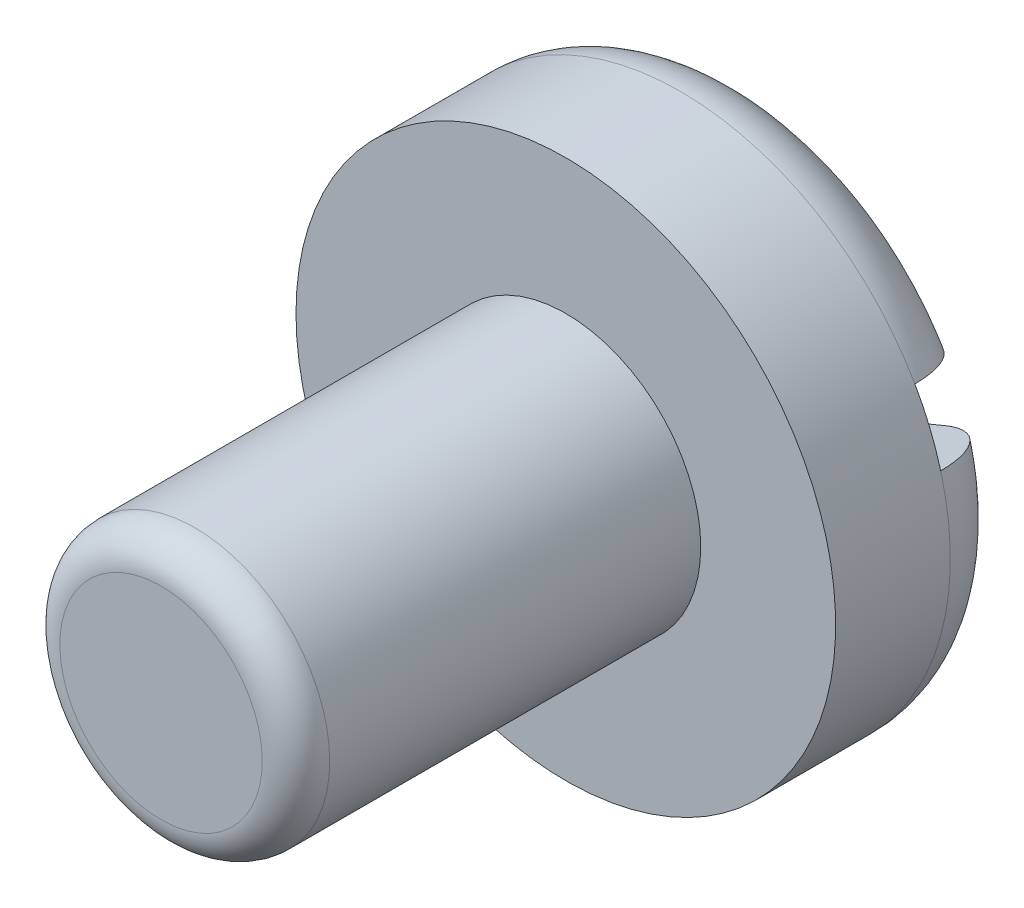
ISO-10303-21;
HEADER;
FILE_DESCRIPTION(('STEP AP214'),'2;1');
FILE_NAME('part.step','',(''),(''),'','','');
FILE_SCHEMA(('AUTOMOTIVE_DESIGN { 1 0 10303 214 1 1 1 1 }'));
ENDSEC;
DATA;
#1=APPLICATION_CONTEXT('core data for automotive mechanical design processes');
#2=APPLICATION_PROTOCOL_DEFINITION('international standard','automotive_design',2000,#1);
#3=PRODUCT_CONTEXT('',#1,'mechanical');
#4=PRODUCT('Part','Part','',(#3));
#5=PRODUCT_RELATED_PRODUCT_CATEGORY('part','',(#4));
#6=PRODUCT_DEFINITION_FORMATION('','',#4);
#7=PRODUCT_DEFINITION_CONTEXT('part definition',#1,'design');
#8=PRODUCT_DEFINITION('design','',#6,#7);
#9=PRODUCT_DEFINITION_SHAPE('','',#8);
#10=(LENGTH_UNIT() NAMED_UNIT(*) SI_UNIT(.MILLI.,.METRE.));
#11=(NAMED_UNIT(*) PLANE_ANGLE_UNIT() SI_UNIT($,.RADIAN.));
#12=(NAMED_UNIT(*) SI_UNIT($,.STERADIAN.) SOLID_ANGLE_UNIT());
#13=UNCERTAINTY_MEASURE_WITH_UNIT(LENGTH_MEASURE(1.E-05),#10,'distance_accuracy_value','');
#14=(GEOMETRIC_REPRESENTATION_CONTEXT(3) GLOBAL_UNCERTAINTY_ASSIGNED_CONTEXT((#13)) GLOBAL_UNIT_ASSIGNED_CONTEXT((#10,
#11,#12)) REPRESENTATION_CONTEXT('',''));
#15=CARTESIAN_POINT('',(0.,0.,0.));
#16=DIRECTION('',(0.,0.,1.));
#17=DIRECTION('',(1.,0.,0.));
#18=AXIS2_PLACEMENT_3D('',#15,#16,#17);
#19=CARTESIAN_POINT('',(-114.698131955546,-30.2113668745844,-143.199999999999));
#20=DIRECTION('',(0.,0.,1.));
#21=DIRECTION('',(1.,0.,0.));
#22=AXIS2_PLACEMENT_3D('',#19,#20,#21);
#23=PLANE('',#22);
#24=DIRECTION('',(-0.923728021347068,-0.383049008063238,0.));
#25=VECTOR('',#24,1.);
#26=CARTESIAN_POINT('',(-114.698131955546,-30.2113668745844,-143.199999999999));
#27=LINE('',#26,#25);
#28=CARTESIAN_POINT('',(-122.058975976254,-33.2637415297654,-143.199999999999));
#29=VERTEX_POINT('',#28);
#30=CARTESIAN_POINT('',(-114.727112105616,-30.2233842839093,-143.199999999999));
#31=VERTEX_POINT('',#30);
#32=EDGE_CURVE('E98',#29,#31,#27,.F.);
#33=ORIENTED_EDGE('',*,*,#32,.T.);
#34=CARTESIAN_POINT('',(-118.201519536903,-32.2054269175109,-143.199999999999));
#35=DIRECTION('',(0.,0.,-1.));
#36=DIRECTION('',(-1.,0.,0.));
#37=AXIS2_PLACEMENT_3D('',#34,#35,#36);
#38=CIRCLE('',#37,4.);
#39=CARTESIAN_POINT('',(-114.344063097552,-31.1471123052565,-143.199999999999));
#40=VERTEX_POINT('',#39);
#41=EDGE_CURVE('E63',#40,#31,#38,.F.);
#42=ORIENTED_EDGE('',*,*,#41,.F.);
#43=DIRECTION('',(0.923728021347068,0.383049008063238,0.));
#44=VECTOR('',#43,1.);
#45=CARTESIAN_POINT('',(-114.315082947483,-31.1350948959315,-143.199999999999));
#46=LINE('',#45,#44);
#47=CARTESIAN_POINT('',(-121.675926968191,-34.1874695511123,-143.199999999999));
#48=VERTEX_POINT('',#47);
#49=EDGE_CURVE('E85',#40,#48,#46,.F.);
#50=ORIENTED_EDGE('',*,*,#49,.T.);
#51=CARTESIAN_POINT('',(-118.201519536903,-32.2054269175109,-143.199999999999));
#52=DIRECTION('',(0.,0.,-1.));
#53=DIRECTION('',(-1.,0.,0.));
#54=AXIS2_PLACEMENT_3D('',#51,#52,#53);
#55=CIRCLE('',#54,4.);
#56=EDGE_CURVE('E69',#29,#48,#55,.F.);
#57=ORIENTED_EDGE('',*,*,#56,.F.);
#58=EDGE_LOOP('',(#33,#42,#50,#57));
#59=FACE_BOUND('',#58,.T.);
#60=ADVANCED_FACE('F17',(#59),#23,.F.);
#61=CARTESIAN_POINT('',(-114.698131955546,-30.2113668745844,-144.199999999999));
#62=DIRECTION('',(-0.383049008063238,0.923728021347068,0.));
#63=DIRECTION('',(-0.923728021347068,-0.383049008063238,0.));
#64=AXIS2_PLACEMENT_3D('',#61,#62,#63);
#65=PLANE('',#64);
#66=ORIENTED_EDGE('',*,*,#32,.F.);
#67=CARTESIAN_POINT('',(-121.125468377022,-32.8766371531072,-144.199999999999));
#68=CARTESIAN_POINT('',(-121.178461283274,-32.898612106454,-144.200042646425));
#69=CARTESIAN_POINT('',(-121.231439447351,-32.9205809465562,-144.195201543032));
#70=CARTESIAN_POINT('',(-121.33589363335,-32.9638957225621,-144.176032715164));
#71=CARTESIAN_POINT('',(-121.387370122207,-32.985241852093,-144.161707973106));
#72=CARTESIAN_POINT('',(-121.487421411564,-33.0267308469683,-144.123838052496));
#73=CARTESIAN_POINT('',(-121.53599397934,-33.0468727864524,-144.100285881759));
#74=CARTESIAN_POINT('',(-121.605501455679,-33.0756959565299,-144.058582449706));
#75=CARTESIAN_POINT('',(-121.628112836652,-33.0850723821143,-144.043618095936));
#76=CARTESIAN_POINT('',(-121.672100144509,-33.1033129185629,-144.011645047463));
#77=CARTESIAN_POINT('',(-121.693474825017,-33.1121765125832,-143.994634341773));
#78=CARTESIAN_POINT('',(-121.755088154336,-33.1377261593772,-143.941046440457));
#79=CARTESIAN_POINT('',(-121.793272156847,-33.1535601970458,-143.901638998176));
#80=CARTESIAN_POINT('',(-121.862900101569,-33.182433322623,-143.816376418218));
#81=CARTESIAN_POINT('',(-121.89434469714,-33.1954726814643,-143.770521906272));
#82=CARTESIAN_POINT('',(-121.935617730862,-33.2125876701424,-143.698165673121));
#83=CARTESIAN_POINT('',(-121.948352165085,-33.2178683504778,-143.6735609017));
#84=CARTESIAN_POINT('',(-121.971840406419,-33.2276083901172,-143.623297301745));
#85=CARTESIAN_POINT('',(-121.982595952564,-33.2320684705595,-143.597639423165));
#86=CARTESIAN_POINT('',(-122.011773324153,-33.2441676631646,-143.519329890651));
#87=CARTESIAN_POINT('',(-122.027138255246,-33.2505391507434,-143.465285506424));
#88=CARTESIAN_POINT('',(-122.045080423841,-33.2579793601169,-143.375729114559));
#89=CARTESIAN_POINT('',(-122.05028817785,-33.260138897298,-143.340798036497));
#90=CARTESIAN_POINT('',(-122.057234163745,-33.263019239721,-143.270585305094));
#91=CARTESIAN_POINT('',(-122.058977427703,-33.2637421316483,-143.235304235128));
#92=CARTESIAN_POINT('',(-122.058975976254,-33.2637415297655,-143.199999999999));
#93=B_SPLINE_CURVE_WITH_KNOTS('',3,(#67,#68,#69,#70,#71,#72,#73,#74,#75,#76,#77,#78,#79,#80,#81,
#82,#83,#84,#85,#86,#87,#88,#89,#90,#91,#92),.UNSPECIFIED.,.F.,.F.,(4,2,2,2,2,2,2,2,2,2,2,2,4),
(0.,0.171872419022453,0.343690813245548,0.515639657347851,0.601620525476747,0.687686589563902,
0.858146296579028,1.02858947074934,1.11311040629361,1.19755670683666,1.36625149222031,
1.4722222164145,1.57803890839399),.UNSPECIFIED.);
#94=CARTESIAN_POINT('',(-121.125468377022,-32.876637153107,-144.199999999999));
#95=VERTEX_POINT('',#94);
#96=EDGE_CURVE('E79',#95,#29,#93,.T.);
#97=ORIENTED_EDGE('',*,*,#96,.F.);
#98=DIRECTION('',(-0.923728021347073,-0.383049008063225,0.));
#99=VECTOR('',#98,1.);
#100=CARTESIAN_POINT('',(-115.660619704848,-30.6104886605678,-144.199999999999));
#101=LINE('',#100,#99);
#102=CARTESIAN_POINT('',(-115.660619704848,-30.6104886605678,-144.199999999999));
#103=VERTEX_POINT('',#102);
#104=EDGE_CURVE('E110',#103,#95,#101,.T.);
#105=ORIENTED_EDGE('',*,*,#104,.F.);
#106=CARTESIAN_POINT('',(-114.727112105615,-30.2233842839095,-143.199999999999));
#107=CARTESIAN_POINT('',(-114.727112209585,-30.2233843270233,-143.227961880797));
#108=CARTESIAN_POINT('',(-114.72820471632,-30.2238373647265,-143.255910312542));
#109=CARTESIAN_POINT('',(-114.732562632482,-30.225644493475,-143.311606244364));
#110=CARTESIAN_POINT('',(-114.735827914014,-30.2269985314848,-143.33935375617));
#111=CARTESIAN_POINT('',(-114.748849309514,-30.232398208137,-143.421937664908));
#112=CARTESIAN_POINT('',(-114.761831076235,-30.2377814516356,-143.476219338172));
#113=CARTESIAN_POINT('',(-114.79602291974,-30.2519600317329,-143.581648442153));
#114=CARTESIAN_POINT('',(-114.817236457162,-30.260756803379,-143.63279454419));
#115=CARTESIAN_POINT('',(-114.867272542123,-30.2815056301643,-143.730521336922));
#116=CARTESIAN_POINT('',(-114.896094144736,-30.2934572934639,-143.777102593589));
#117=CARTESIAN_POINT('',(-114.960598321075,-30.3202057087895,-143.864528526371));
#118=CARTESIAN_POINT('',(-114.996300700844,-30.3350106739307,-143.905356038563));
#119=CARTESIAN_POINT('',(-115.073512952559,-30.3670288391764,-143.980014616325));
#120=CARTESIAN_POINT('',(-115.115023152447,-30.3842421752711,-144.013845286546));
#121=CARTESIAN_POINT('',(-115.180875117601,-30.4115494879742,-144.058754059065));
#122=CARTESIAN_POINT('',(-115.203533194804,-30.4209452774238,-144.072800369914));
#123=CARTESIAN_POINT('',(-115.249831195341,-30.4401440055896,-144.098784085131));
#124=CARTESIAN_POINT('',(-115.27347021735,-30.4499465705467,-144.110723374733));
#125=CARTESIAN_POINT('',(-115.345648646063,-30.4798773238455,-144.143271250693));
#126=CARTESIAN_POINT('',(-115.395485393537,-30.5005434899073,-144.160634307904));
#127=CARTESIAN_POINT('',(-115.481401159921,-30.5361708047983,-144.182261856178));
#128=CARTESIAN_POINT('',(-115.516992590323,-30.5509297617599,-144.188913186675));
#129=CARTESIAN_POINT('',(-115.588589702589,-30.5806194563452,-144.197780726864));
#130=CARTESIAN_POINT('',(-115.624594679549,-30.5955499016613,-144.200003603459));
#131=CARTESIAN_POINT('',(-115.660619704848,-30.610488660568,-144.199999999999));
#132=B_SPLINE_CURVE_WITH_KNOTS('',3,(#106,#107,#108,#109,#110,#111,#112,#113,#114,#115,#116,
#117,#118,#119,#120,#121,#122,#123,#124,#125,#126,#127,#128,#129,#130,#131),.UNSPECIFIED.,.F.,
.F.,(4,2,2,2,2,2,2,2,2,2,2,2,4),(0.,0.0838339468248424,0.167662959367298,0.335013254061391,
0.502433979184718,0.669833920326452,0.837723113295849,1.00562179006333,1.09033330839502,
1.1749686434408,1.34410300766478,1.46117139805609,1.57806341197275),.UNSPECIFIED.);
#133=EDGE_CURVE('E96',#31,#103,#132,.T.);
#134=ORIENTED_EDGE('',*,*,#133,.F.);
#135=EDGE_LOOP('',(#66,#97,#105,#134));
#136=FACE_BOUND('',#135,.T.);
#137=ADVANCED_FACE('F219',(#136),#65,.F.);
#138=CARTESIAN_POINT('',(-114.315082947483,-31.1350948959315,-144.199999999999));
#139=DIRECTION('',(0.383049008063238,-0.923728021347068,0.));
#140=DIRECTION('',(0.923728021347068,0.383049008063238,0.));
#141=AXIS2_PLACEMENT_3D('',#138,#139,#140);
#142=PLANE('',#141);
#143=DIRECTION('',(0.923728021347054,0.383049008063273,0.));
#144=VECTOR('',#143,1.);
#145=CARTESIAN_POINT('',(-120.742419368958,-33.8003651744541,-144.199999999999));
#146=LINE('',#145,#144);
#147=CARTESIAN_POINT('',(-120.742419368958,-33.8003651744541,-144.199999999999));
#148=VERTEX_POINT('',#147);
#149=CARTESIAN_POINT('',(-115.277570696785,-31.534216681915,-144.199999999999));
#150=VERTEX_POINT('',#149);
#151=EDGE_CURVE('E87',#148,#150,#146,.T.);
#152=ORIENTED_EDGE('',*,*,#151,.F.);
#153=CARTESIAN_POINT('',(-121.675926968191,-34.1874695511124,-143.199999999999));
#154=CARTESIAN_POINT('',(-121.675926864221,-34.1874695079987,-143.227961880797));
#155=CARTESIAN_POINT('',(-121.674834357486,-34.1870164702955,-143.255910312542));
#156=CARTESIAN_POINT('',(-121.670476441324,-34.1852093415469,-143.311606244364));
#157=CARTESIAN_POINT('',(-121.667211159792,-34.1838553035371,-143.33935375617));
#158=CARTESIAN_POINT('',(-121.654189764292,-34.1784556268849,-143.421937664908));
#159=CARTESIAN_POINT('',(-121.641207997571,-34.1730723833863,-143.476219338172));
#160=CARTESIAN_POINT('',(-121.607016154066,-34.1588938032891,-143.581648442153));
#161=CARTESIAN_POINT('',(-121.585802616644,-34.1500970316429,-143.63279454419));
#162=CARTESIAN_POINT('',(-121.535766531683,-34.1293482048576,-143.730521336922));
#163=CARTESIAN_POINT('',(-121.50694492907,-34.117396541558,-143.777102593589));
#164=CARTESIAN_POINT('',(-121.442440752731,-34.0906481262325,-143.864528526371));
#165=CARTESIAN_POINT('',(-121.406738372962,-34.0758431610912,-143.905356038563));
#166=CARTESIAN_POINT('',(-121.329526121247,-34.0438249958455,-143.980014616325));
#167=CARTESIAN_POINT('',(-121.288015921359,-34.0266116597509,-144.013845286546));
#168=CARTESIAN_POINT('',(-121.222163956204,-33.9993043470477,-144.058754059065));
#169=CARTESIAN_POINT('',(-121.199505879001,-33.9899085575982,-144.072800369914));
#170=CARTESIAN_POINT('',(-121.153207878464,-33.9707098294323,-144.098784085131));
#171=CARTESIAN_POINT('',(-121.129568856456,-33.9609072644753,-144.110723374733));
#172=CARTESIAN_POINT('',(-121.057390427743,-33.9309765111764,-144.143271250693));
#173=CARTESIAN_POINT('',(-121.007553680269,-33.9103103451146,-144.160634307904));
#174=CARTESIAN_POINT('',(-120.921637913885,-33.8746830302236,-144.182261856178));
#175=CARTESIAN_POINT('',(-120.886046483482,-33.859924073262,-144.188913186675));
#176=CARTESIAN_POINT('',(-120.814449371217,-33.8302343786768,-144.197780726864));
#177=CARTESIAN_POINT('',(-120.778444394257,-33.8153039333607,-144.200003603459));
#178=CARTESIAN_POINT('',(-120.742419368958,-33.800365174454,-144.199999999999));
#179=B_SPLINE_CURVE_WITH_KNOTS('',3,(#153,#154,#155,#156,#157,#158,#159,#160,#161,#162,#163,
#164,#165,#166,#167,#168,#169,#170,#171,#172,#173,#174,#175,#176,#177,#178),.UNSPECIFIED.,.F.,
.F.,(4,2,2,2,2,2,2,2,2,2,2,2,4),(0.,0.0838339468248414,0.167662959367298,0.335013254061395,
0.50243397918474,0.669833920326474,0.837723113295902,1.00562179006339,1.09033330839508,
1.17496864344082,1.3441030076648,1.46117139805609,1.57806341197271),.UNSPECIFIED.);
#180=EDGE_CURVE('E83',#48,#148,#179,.T.);
#181=ORIENTED_EDGE('',*,*,#180,.F.);
#182=ORIENTED_EDGE('',*,*,#49,.F.);
#183=CARTESIAN_POINT('',(-115.277570696785,-31.5342166819151,-144.199999999999));
#184=CARTESIAN_POINT('',(-115.224577790533,-31.5122417285682,-144.200042646425));
#185=CARTESIAN_POINT('',(-115.171599626455,-31.490272888466,-144.195201543032));
#186=CARTESIAN_POINT('',(-115.067145440456,-31.4469581124602,-144.176032715164));
#187=CARTESIAN_POINT('',(-115.0156689516,-31.4256119829292,-144.161707973106));
#188=CARTESIAN_POINT('',(-114.915617662242,-31.3841229880539,-144.123838052496));
#189=CARTESIAN_POINT('',(-114.867045094466,-31.3639810485699,-144.10028588176));
#190=CARTESIAN_POINT('',(-114.797537618127,-31.3351578784923,-144.058582449707));
#191=CARTESIAN_POINT('',(-114.774926237155,-31.3257814529079,-144.043618095937));
#192=CARTESIAN_POINT('',(-114.730938929298,-31.3075409164593,-144.011645047463));
#193=CARTESIAN_POINT('',(-114.70956424879,-31.298677322439,-143.994634341774));
#194=CARTESIAN_POINT('',(-114.64795091947,-31.273127675645,-143.941046440458));
#195=CARTESIAN_POINT('',(-114.60976691696,-31.2572936379764,-143.901638998177));
#196=CARTESIAN_POINT('',(-114.540138972237,-31.2284205123991,-143.816376418219));
#197=CARTESIAN_POINT('',(-114.508694376667,-31.2153811535579,-143.770521906273));
#198=CARTESIAN_POINT('',(-114.467421342945,-31.1982661648797,-143.698165673121));
#199=CARTESIAN_POINT('',(-114.454686908721,-31.1929854845444,-143.673560901701));
#200=CARTESIAN_POINT('',(-114.431198667387,-31.1832454449049,-143.623297301745));
#201=CARTESIAN_POINT('',(-114.420443121243,-31.1787853644626,-143.597639423165));
#202=CARTESIAN_POINT('',(-114.391265749654,-31.1666861718575,-143.519329890652));
#203=CARTESIAN_POINT('',(-114.37590081856,-31.1603146842786,-143.465285506425));
#204=CARTESIAN_POINT('',(-114.357958649965,-31.1528744749051,-143.375729114559));
#205=CARTESIAN_POINT('',(-114.352750895956,-31.150714937724,-143.340798036497));
#206=CARTESIAN_POINT('',(-114.345804910061,-31.147834595301,-143.270585305094));
#207=CARTESIAN_POINT('',(-114.344061646103,-31.1471117033737,-143.235304235128));
#208=CARTESIAN_POINT('',(-114.344063097552,-31.1471123052565,-143.199999999999));
#209=B_SPLINE_CURVE_WITH_KNOTS('',3,(#183,#184,#185,#186,#187,#188,#189,#190,#191,#192,#193,
#194,#195,#196,#197,#198,#199,#200,#201,#202,#203,#204,#205,#206,#207,#208),.UNSPECIFIED.,.F.,
.F.,(4,2,2,2,2,2,2,2,2,2,2,2,4),(0.,0.171872419022462,0.343690813245583,0.515639657347896,
0.601620525476801,0.687686589563978,0.858146296579105,1.02858947074941,1.11311040629369,
1.19755670683674,1.36625149222042,1.47222221641493,1.57803890839475),.UNSPECIFIED.);
#210=EDGE_CURVE('E91',#150,#40,#209,.T.);
#211=ORIENTED_EDGE('',*,*,#210,.F.);
#212=EDGE_LOOP('',(#152,#181,#182,#211));
#213=FACE_BOUND('',#212,.T.);
#214=ADVANCED_FACE('F84',(#213),#142,.F.);
#215=CARTESIAN_POINT('',(-118.201519536903,-32.2054269175109,-144.199999999999));
#216=DIRECTION('',(0.,0.,-1.));
#217=DIRECTION('',(-1.,0.,0.));
#218=AXIS2_PLACEMENT_3D('',#215,#216,#217);
#219=PLANE('',#218);
#220=ORIENTED_EDGE('',*,*,#104,.T.);
#221=CARTESIAN_POINT('',(-118.201519536903,-32.2054269175109,-144.199999999999));
#222=DIRECTION('',(0.,0.,1.));
#223=DIRECTION('',(0.846966610685103,0.531646085647764,0.));
#224=AXIS2_PLACEMENT_3D('',#221,#222,#223);
#225=CIRCLE('',#224,2.99999999999964);
#226=EDGE_CURVE('E186',#103,#95,#225,.T.);
#227=ORIENTED_EDGE('',*,*,#226,.F.);
#228=EDGE_LOOP('',(#220,#227));
#229=FACE_BOUND('',#228,.T.);
#230=ADVANCED_FACE('F206',(#229),#219,.T.);
#231=CARTESIAN_POINT('',(-118.201519536903,-32.2054269175109,-144.199999999999));
#232=DIRECTION('',(0.,0.,-1.));
#233=DIRECTION('',(-1.,0.,0.));
#234=AXIS2_PLACEMENT_3D('',#231,#232,#233);
#235=PLANE('',#234);
#236=ORIENTED_EDGE('',*,*,#151,.T.);
#237=CARTESIAN_POINT('',(-118.201519536903,-32.2054269175109,-144.199999999999));
#238=DIRECTION('',(0.,0.,1.));
#239=DIRECTION('',(-0.846966610685084,-0.531646085647793,0.));
#240=AXIS2_PLACEMENT_3D('',#237,#238,#239);
#241=CIRCLE('',#240,2.99999999999968);
#242=EDGE_CURVE('E176',#148,#150,#241,.T.);
#243=ORIENTED_EDGE('',*,*,#242,.F.);
#244=EDGE_LOOP('',(#236,#243));
#245=FACE_BOUND('',#244,.T.);
#246=ADVANCED_FACE('F155',(#245),#235,.T.);
#247=CARTESIAN_POINT('',(-118.201519536903,-32.2054269175109,-135.499999999999));
#248=DIRECTION('',(0.,0.,-1.));
#249=DIRECTION('',(-1.,0.,0.));
#250=AXIS2_PLACEMENT_3D('',#247,#248,#249);
#251=PLANE('',#250);
#252=CARTESIAN_POINT('',(-118.201519536903,-32.2054269175109,-135.499999999999));
#253=DIRECTION('',(0.,0.,-1.));
#254=DIRECTION('',(-0.923728021347069,-0.383049008063237,0.));
#255=AXIS2_PLACEMENT_3D('',#252,#253,#254);
#256=CIRCLE('',#255,1.50000000000034);
#257=CARTESIAN_POINT('',(-119.587111568924,-32.7800004296058,-135.499999999999));
#258=VERTEX_POINT('',#257);
#259=CARTESIAN_POINT('',(-116.815927504882,-31.630853405416,-135.499999999999));
#260=VERTEX_POINT('',#259);
#261=EDGE_CURVE('E36',#258,#260,#256,.T.);
#262=ORIENTED_EDGE('',*,*,#261,.F.);
#263=CARTESIAN_POINT('',(-118.201519536903,-32.2054269175109,-135.499999999999));
#264=DIRECTION('',(0.,0.,-1.));
#265=DIRECTION('',(0.923728021347058,0.383049008063263,0.));
#266=AXIS2_PLACEMENT_3D('',#263,#264,#265);
#267=CIRCLE('',#266,1.5000000000004);
#268=EDGE_CURVE('E383',#260,#258,#267,.T.);
#269=ORIENTED_EDGE('',*,*,#268,.F.);
#270=EDGE_LOOP('',(#262,#269));
#271=FACE_BOUND('',#270,.T.);
#272=ADVANCED_FACE('F146',(#271),#251,.F.);
#273=CARTESIAN_POINT('',(-118.201519536903,-32.2054269175109,-143.199999999999));
#274=DIRECTION('',(0.,0.,-1.));
#275=DIRECTION('',(-0.923728021347068,-0.383049008063237,0.));
#276=AXIS2_PLACEMENT_3D('',#273,#274,#275);
#277=TOROIDAL_SURFACE('',#276,2.99999999999999,1.);
#278=ORIENTED_EDGE('',*,*,#96,.T.);
#279=CARTESIAN_POINT('',(-118.201519536903,-32.2054269175109,-143.199999999999));
#280=DIRECTION('',(0.,0.,-1.));
#281=DIRECTION('',(-1.,0.,0.));
#282=AXIS2_PLACEMENT_3D('',#279,#280,#281);
#283=CIRCLE('',#282,4.);
#284=EDGE_CURVE('E77',#31,#29,#283,.F.);
#285=ORIENTED_EDGE('',*,*,#284,.F.);
#286=ORIENTED_EDGE('',*,*,#133,.T.);
#287=ORIENTED_EDGE('',*,*,#226,.T.);
#288=EDGE_LOOP('',(#278,#285,#286,#287));
#289=FACE_BOUND('',#288,.T.);
#290=ADVANCED_FACE('F124',(#289),#277,.T.);
#291=CARTESIAN_POINT('',(-118.201519536903,-32.2054269175109,-143.199999999999));
#292=DIRECTION('',(0.,0.,-1.));
#293=DIRECTION('',(-0.923728021347068,-0.383049008063237,0.));
#294=AXIS2_PLACEMENT_3D('',#291,#292,#293);
#295=TOROIDAL_SURFACE('',#294,2.99999999999999,1.);
#296=ORIENTED_EDGE('',*,*,#180,.T.);
#297=ORIENTED_EDGE('',*,*,#242,.T.);
#298=ORIENTED_EDGE('',*,*,#210,.T.);
#299=CARTESIAN_POINT('',(-118.201519536903,-32.2054269175109,-143.199999999999));
#300=DIRECTION('',(0.,0.,-1.));
#301=DIRECTION('',(-1.,0.,0.));
#302=AXIS2_PLACEMENT_3D('',#299,#300,#301);
#303=CIRCLE('',#302,4.);
#304=EDGE_CURVE('E74',#48,#40,#303,.F.);
#305=ORIENTED_EDGE('',*,*,#304,.F.);
#306=EDGE_LOOP('',(#296,#297,#298,#305));
#307=FACE_BOUND('',#306,.T.);
#308=ADVANCED_FACE('F93',(#307),#295,.T.);
#309=CARTESIAN_POINT('',(-118.201519536903,-32.2054269175109,-135.999999999999));
#310=DIRECTION('',(0.,0.,-1.));
#311=DIRECTION('',(-0.923728021347068,-0.383049008063237,0.));
#312=AXIS2_PLACEMENT_3D('',#309,#310,#311);
#313=TOROIDAL_SURFACE('',#312,1.5,0.5);
#314=CARTESIAN_POINT('',(-118.201519536903,-32.2054269175109,-135.999999999999));
#315=DIRECTION('',(0.,0.,1.));
#316=DIRECTION('',(1.,0.,0.));
#317=AXIS2_PLACEMENT_3D('',#314,#315,#316);
#318=CIRCLE('',#317,2.);
#319=CARTESIAN_POINT('',(-116.201519536903,-32.2054269175109,-135.999999999999));
#320=VERTEX_POINT('',#319);
#321=EDGE_CURVE('E94',#320,#320,#318,.F.);
#322=ORIENTED_EDGE('',*,*,#321,.F.);
#323=EDGE_LOOP('',(#322));
#324=FACE_BOUND('',#323,.T.);
#325=ORIENTED_EDGE('',*,*,#261,.T.);
#326=ORIENTED_EDGE('',*,*,#268,.T.);
#327=EDGE_LOOP('',(#325,#326));
#328=FACE_BOUND('',#327,.T.);
#329=ADVANCED_FACE('F123',(#324,#328),#313,.T.);
#330=CARTESIAN_POINT('',(-118.201519536903,-32.2054269175109,-144.199999999999));
#331=DIRECTION('',(0.,0.,-1.));
#332=DIRECTION('',(-1.,0.,0.));
#333=AXIS2_PLACEMENT_3D('',#330,#331,#332);
#334=CYLINDRICAL_SURFACE('',#333,4.);
#335=ORIENTED_EDGE('',*,*,#56,.T.);
#336=ORIENTED_EDGE('',*,*,#304,.T.);
#337=ORIENTED_EDGE('',*,*,#41,.T.);
#338=ORIENTED_EDGE('',*,*,#284,.T.);
#339=EDGE_LOOP('',(#335,#336,#337,#338));
#340=FACE_BOUND('',#339,.T.);
#341=CARTESIAN_POINT('',(-118.201519536903,-32.2054269175109,-141.499999999999));
#342=DIRECTION('',(0.,0.,-1.));
#343=DIRECTION('',(-1.,0.,0.));
#344=AXIS2_PLACEMENT_3D('',#341,#342,#343);
#345=CIRCLE('',#344,4.);
#346=CARTESIAN_POINT('',(-122.201519536903,-32.2054269175109,-141.499999999999));
#347=VERTEX_POINT('',#346);
#348=EDGE_CURVE('E28',#347,#347,#345,.T.);
#349=ORIENTED_EDGE('',*,*,#348,.T.);
#350=EDGE_LOOP('',(#349));
#351=FACE_BOUND('',#350,.T.);
#352=ADVANCED_FACE('F71',(#340,#351),#334,.T.);
#353=CARTESIAN_POINT('',(-118.201519536903,-32.2054269175109,-135.499999999999));
#354=DIRECTION('',(0.,0.,1.));
#355=DIRECTION('',(1.,0.,0.));
#356=AXIS2_PLACEMENT_3D('',#353,#354,#355);
#357=CYLINDRICAL_SURFACE('',#356,2.);
#358=CARTESIAN_POINT('',(-118.201519536903,-32.2054269175109,-141.499999999999));
#359=DIRECTION('',(0.,0.,1.));
#360=DIRECTION('',(1.,0.,0.));
#361=AXIS2_PLACEMENT_3D('',#358,#359,#360);
#362=CIRCLE('',#361,2.);
#363=CARTESIAN_POINT('',(-116.201519536903,-32.2054269175109,-141.499999999999));
#364=VERTEX_POINT('',#363);
#365=EDGE_CURVE('E11',#364,#364,#362,.T.);
#366=ORIENTED_EDGE('',*,*,#365,.T.);
#367=EDGE_LOOP('',(#366));
#368=FACE_BOUND('',#367,.T.);
#369=ORIENTED_EDGE('',*,*,#321,.T.);
#370=EDGE_LOOP('',(#369));
#371=FACE_BOUND('',#370,.T.);
#372=ADVANCED_FACE('F222',(#368,#371),#357,.T.);
#373=CARTESIAN_POINT('',(-118.201519536903,-32.2054269175109,-141.499999999999));
#374=DIRECTION('',(0.,0.,-1.));
#375=DIRECTION('',(-1.,0.,0.));
#376=AXIS2_PLACEMENT_3D('',#373,#374,#375);
#377=PLANE('',#376);
#378=ORIENTED_EDGE('',*,*,#365,.F.);
#379=EDGE_LOOP('',(#378));
#380=FACE_BOUND('',#379,.T.);
#381=ORIENTED_EDGE('',*,*,#348,.F.);
#382=EDGE_LOOP('',(#381));
#383=FACE_BOUND('',#382,.T.);
#384=ADVANCED_FACE('F220',(#380,#383),#377,.F.);
#385=CLOSED_SHELL('',(#60,#137,#214,#230,#246,#272,#290,#308,#329,#352,#372,#384));
#386=MANIFOLD_SOLID_BREP('B1',#385);
#387=ADVANCED_BREP_SHAPE_REPRESENTATION('',(#18,#386),#14);
#388=SHAPE_DEFINITION_REPRESENTATION(#9,#387);
ENDSEC;
END-ISO-10303-21;
